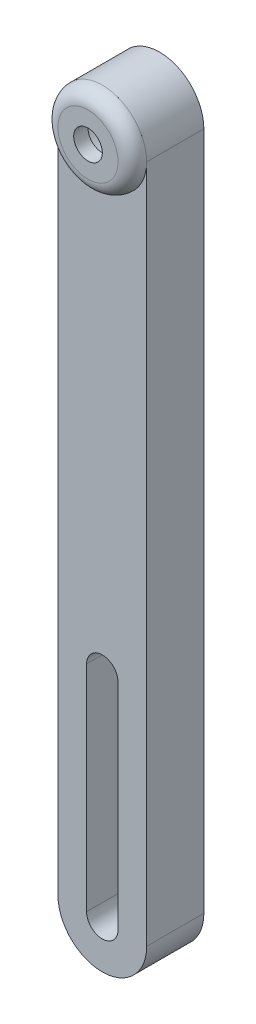
ISO-10303-21;
HEADER;
FILE_DESCRIPTION(('STEP AP214'),'2;1');
FILE_NAME('part.step','',(''),(''),'','','');
FILE_SCHEMA(('AUTOMOTIVE_DESIGN { 1 0 10303 214 1 1 1 1 }'));
ENDSEC;
DATA;
#1=APPLICATION_CONTEXT('core data for automotive mechanical design processes');
#2=APPLICATION_PROTOCOL_DEFINITION('international standard','automotive_design',2000,#1);
#3=PRODUCT_CONTEXT('',#1,'mechanical');
#4=PRODUCT('Part','Part','',(#3));
#5=PRODUCT_RELATED_PRODUCT_CATEGORY('part','',(#4));
#6=PRODUCT_DEFINITION_FORMATION('','',#4);
#7=PRODUCT_DEFINITION_CONTEXT('part definition',#1,'design');
#8=PRODUCT_DEFINITION('design','',#6,#7);
#9=PRODUCT_DEFINITION_SHAPE('','',#8);
#10=(LENGTH_UNIT() NAMED_UNIT(*) SI_UNIT(.MILLI.,.METRE.));
#11=(NAMED_UNIT(*) PLANE_ANGLE_UNIT() SI_UNIT($,.RADIAN.));
#12=(NAMED_UNIT(*) SI_UNIT($,.STERADIAN.) SOLID_ANGLE_UNIT());
#13=UNCERTAINTY_MEASURE_WITH_UNIT(LENGTH_MEASURE(1.E-05),#10,'distance_accuracy_value','');
#14=(GEOMETRIC_REPRESENTATION_CONTEXT(3) GLOBAL_UNCERTAINTY_ASSIGNED_CONTEXT((#13)) GLOBAL_UNIT_ASSIGNED_CONTEXT((#10,
#11,#12)) REPRESENTATION_CONTEXT('',''));
#15=CARTESIAN_POINT('',(0.,0.,0.));
#16=DIRECTION('',(0.,0.,1.));
#17=DIRECTION('',(1.,0.,0.));
#18=AXIS2_PLACEMENT_3D('',#15,#16,#17);
#19=CARTESIAN_POINT('',(-8.77761700194678,7.12304347826087,5.));
#20=DIRECTION('',(0.,0.,1.));
#21=DIRECTION('',(1.,0.,0.));
#22=AXIS2_PLACEMENT_3D('',#19,#20,#21);
#23=PLANE('',#22);
#24=CARTESIAN_POINT('',(-8.77761700194678,7.12304347826087,5.));
#25=DIRECTION('',(0.,0.,1.));
#26=DIRECTION('',(1.,0.,0.));
#27=AXIS2_PLACEMENT_3D('',#24,#25,#26);
#28=CIRCLE('',#27,2.1);
#29=CARTESIAN_POINT('',(-6.67761700194678,7.12304347826087,5.));
#30=VERTEX_POINT('',#29);
#31=EDGE_CURVE('E11',#30,#30,#28,.T.);
#32=ORIENTED_EDGE('',*,*,#31,.T.);
#33=EDGE_LOOP('',(#32));
#34=FACE_BOUND('',#33,.T.);
#35=CARTESIAN_POINT('',(-8.77761700194678,7.12304347826087,5.));
#36=DIRECTION('',(0.,0.,1.));
#37=DIRECTION('',(1.,0.,0.));
#38=AXIS2_PLACEMENT_3D('',#35,#36,#37);
#39=CIRCLE('',#38,1.);
#40=CARTESIAN_POINT('',(-7.77761700194678,7.12304347826087,5.));
#41=VERTEX_POINT('',#40);
#42=EDGE_CURVE('E54',#41,#41,#39,.T.);
#43=ORIENTED_EDGE('',*,*,#42,.F.);
#44=EDGE_LOOP('',(#43));
#45=FACE_BOUND('',#44,.T.);
#46=ADVANCED_FACE('F43',(#34,#45),#23,.T.);
#47=CARTESIAN_POINT('',(-8.77761700194678,7.12304347826087,4.));
#48=DIRECTION('',(0.,0.,1.));
#49=DIRECTION('',(1.,0.,0.));
#50=AXIS2_PLACEMENT_3D('',#47,#48,#49);
#51=PLANE('',#50);
#52=CARTESIAN_POINT('',(-8.77761700194678,7.12304347826087,4.));
#53=DIRECTION('',(0.,0.,1.));
#54=DIRECTION('',(1.,0.,0.));
#55=AXIS2_PLACEMENT_3D('',#52,#53,#54);
#56=CIRCLE('',#55,3.1);
#57=CARTESIAN_POINT('',(-5.67761700194678,7.12304347826087,4.));
#58=VERTEX_POINT('',#57);
#59=EDGE_CURVE('E50',#58,#58,#56,.T.);
#60=ORIENTED_EDGE('',*,*,#59,.F.);
#61=EDGE_LOOP('',(#60));
#62=FACE_BOUND('',#61,.T.);
#63=CARTESIAN_POINT('',(-8.77761700194678,7.12304347826087,4.));
#64=DIRECTION('',(0.,0.,1.));
#65=DIRECTION('',(1.,0.,0.));
#66=AXIS2_PLACEMENT_3D('',#63,#64,#65);
#67=CIRCLE('',#66,1.);
#68=CARTESIAN_POINT('',(-7.77761700194678,7.12304347826087,4.));
#69=VERTEX_POINT('',#68);
#70=EDGE_CURVE('E58',#69,#69,#67,.T.);
#71=ORIENTED_EDGE('',*,*,#70,.T.);
#72=EDGE_LOOP('',(#71));
#73=FACE_BOUND('',#72,.T.);
#74=ADVANCED_FACE('F64',(#62,#73),#51,.F.);
#75=CARTESIAN_POINT('',(-8.77761700194678,7.12304347826087,5.));
#76=DIRECTION('',(0.,0.,-1.));
#77=DIRECTION('',(-1.,0.,0.));
#78=AXIS2_PLACEMENT_3D('',#75,#76,#77);
#79=CYLINDRICAL_SURFACE('',#78,1.);
#80=ORIENTED_EDGE('',*,*,#42,.T.);
#81=EDGE_LOOP('',(#80));
#82=FACE_BOUND('',#81,.T.);
#83=ORIENTED_EDGE('',*,*,#70,.F.);
#84=EDGE_LOOP('',(#83));
#85=FACE_BOUND('',#84,.T.);
#86=ADVANCED_FACE('F66',(#82,#85),#79,.F.);
#87=CARTESIAN_POINT('',(-8.77761700194678,7.12304347826087,4.));
#88=DIRECTION('',(0.,0.,1.));
#89=DIRECTION('',(1.,0.,0.));
#90=AXIS2_PLACEMENT_3D('',#87,#88,#89);
#91=TOROIDAL_SURFACE('',#90,2.1,1.);
#92=ORIENTED_EDGE('',*,*,#59,.T.);
#93=EDGE_LOOP('',(#92));
#94=FACE_BOUND('',#93,.T.);
#95=ORIENTED_EDGE('',*,*,#31,.F.);
#96=EDGE_LOOP('',(#95));
#97=FACE_BOUND('',#96,.T.);
#98=ADVANCED_FACE('F45',(#94,#97),#91,.T.);
#99=CLOSED_SHELL('',(#46,#74,#86,#98));
#100=MANIFOLD_SOLID_BREP('B2',#99);
#101=CARTESIAN_POINT('',(-8.77761700194678,7.12304347826087,4.));
#102=DIRECTION('',(0.,0.,1.));
#103=DIRECTION('',(1.,0.,0.));
#104=AXIS2_PLACEMENT_3D('',#101,#102,#103);
#105=PLANE('',#104);
#106=CARTESIAN_POINT('',(-8.77761700194678,7.12304347826087,4.));
#107=DIRECTION('',(0.,0.,1.));
#108=DIRECTION('',(1.,0.,0.));
#109=AXIS2_PLACEMENT_3D('',#106,#107,#108);
#110=CIRCLE('',#109,3.1);
#111=CARTESIAN_POINT('',(-5.67761700194678,7.12304347826087,4.));
#112=VERTEX_POINT('',#111);
#113=CARTESIAN_POINT('',(-11.8776170019468,7.12304347826087,4.));
#114=VERTEX_POINT('',#113);
#115=EDGE_CURVE('E212',#112,#114,#110,.T.);
#116=ORIENTED_EDGE('',*,*,#115,.T.);
#117=DIRECTION('',(0.,-1.,0.));
#118=VECTOR('',#117,1.);
#119=CARTESIAN_POINT('',(-11.8776170019468,7.12304347826087,4.));
#120=LINE('',#119,#118);
#121=CARTESIAN_POINT('',(-11.8776170019468,-40.3769565217391,4.));
#122=VERTEX_POINT('',#121);
#123=EDGE_CURVE('E215',#114,#122,#120,.T.);
#124=ORIENTED_EDGE('',*,*,#123,.T.);
#125=CARTESIAN_POINT('',(-8.77761700194678,-40.3769565217391,4.));
#126=DIRECTION('',(0.,0.,1.));
#127=DIRECTION('',(1.,0.,0.));
#128=AXIS2_PLACEMENT_3D('',#125,#126,#127);
#129=CIRCLE('',#128,3.1);
#130=CARTESIAN_POINT('',(-5.67761700194677,-40.3769565217391,4.));
#131=VERTEX_POINT('',#130);
#132=EDGE_CURVE('E218',#122,#131,#129,.T.);
#133=ORIENTED_EDGE('',*,*,#132,.T.);
#134=DIRECTION('',(0.,1.,0.));
#135=VECTOR('',#134,1.);
#136=CARTESIAN_POINT('',(-5.67761700194678,7.12304347826087,4.));
#137=LINE('',#136,#135);
#138=EDGE_CURVE('E220',#131,#112,#137,.T.);
#139=ORIENTED_EDGE('',*,*,#138,.T.);
#140=EDGE_LOOP('',(#116,#124,#133,#139));
#141=FACE_BOUND('',#140,.T.);
#142=CARTESIAN_POINT('',(-8.77761700194678,7.12304347826087,4.));
#143=DIRECTION('',(0.,0.,1.));
#144=DIRECTION('',(1.,0.,0.));
#145=AXIS2_PLACEMENT_3D('',#142,#143,#144);
#146=CIRCLE('',#145,2.5);
#147=CARTESIAN_POINT('',(-6.27761700194678,7.12304347826087,4.));
#148=VERTEX_POINT('',#147);
#149=EDGE_CURVE('E206',#148,#148,#146,.T.);
#150=ORIENTED_EDGE('',*,*,#149,.F.);
#151=EDGE_LOOP('',(#150));
#152=FACE_BOUND('',#151,.T.);
#153=DIRECTION('',(0.,-1.,0.));
#154=VECTOR('',#153,1.);
#155=CARTESIAN_POINT('',(-9.87761700194677,-25.3769565217391,4.));
#156=LINE('',#155,#154);
#157=CARTESIAN_POINT('',(-9.87761700194677,-25.3769565217391,4.));
#158=VERTEX_POINT('',#157);
#159=CARTESIAN_POINT('',(-9.87761700194677,-40.3769565217391,4.));
#160=VERTEX_POINT('',#159);
#161=EDGE_CURVE('E178',#158,#160,#156,.T.);
#162=ORIENTED_EDGE('',*,*,#161,.F.);
#163=CARTESIAN_POINT('',(-8.77761700194678,-25.3769565217391,4.));
#164=DIRECTION('',(0.,0.,1.));
#165=DIRECTION('',(1.,0.,0.));
#166=AXIS2_PLACEMENT_3D('',#163,#164,#165);
#167=CIRCLE('',#166,1.09999999999999);
#168=CARTESIAN_POINT('',(-7.67761700194678,-25.3769565217391,4.));
#169=VERTEX_POINT('',#168);
#170=EDGE_CURVE('E170',#169,#158,#167,.T.);
#171=ORIENTED_EDGE('',*,*,#170,.F.);
#172=DIRECTION('',(0.,1.,0.));
#173=VECTOR('',#172,1.);
#174=CARTESIAN_POINT('',(-7.67761700194678,-25.3769565217391,4.));
#175=LINE('',#174,#173);
#176=CARTESIAN_POINT('',(-7.67761700194678,-40.3769565217391,4.));
#177=VERTEX_POINT('',#176);
#178=EDGE_CURVE('E192',#177,#169,#175,.T.);
#179=ORIENTED_EDGE('',*,*,#178,.F.);
#180=CARTESIAN_POINT('',(-8.77761700194678,-40.3769565217391,4.));
#181=DIRECTION('',(0.,0.,1.));
#182=DIRECTION('',(1.,0.,0.));
#183=AXIS2_PLACEMENT_3D('',#180,#181,#182);
#184=CIRCLE('',#183,1.09999999999999);
#185=EDGE_CURVE('E190',#160,#177,#184,.T.);
#186=ORIENTED_EDGE('',*,*,#185,.F.);
#187=EDGE_LOOP('',(#162,#171,#179,#186));
#188=FACE_BOUND('',#187,.T.);
#189=ADVANCED_FACE('F105',(#141,#152,#188),#105,.T.);
#190=CARTESIAN_POINT('',(-8.77761700194678,7.12304347826087,0.));
#191=DIRECTION('',(0.,0.,1.));
#192=DIRECTION('',(1.,0.,0.));
#193=AXIS2_PLACEMENT_3D('',#190,#191,#192);
#194=PLANE('',#193);
#195=CARTESIAN_POINT('',(-8.77761700194678,7.12304347826087,0.));
#196=DIRECTION('',(0.,0.,1.));
#197=DIRECTION('',(1.,0.,0.));
#198=AXIS2_PLACEMENT_3D('',#195,#196,#197);
#199=CIRCLE('',#198,2.5);
#200=CARTESIAN_POINT('',(-6.27761700194678,7.12304347826087,0.));
#201=VERTEX_POINT('',#200);
#202=EDGE_CURVE('E186',#201,#201,#199,.T.);
#203=ORIENTED_EDGE('',*,*,#202,.T.);
#204=EDGE_LOOP('',(#203));
#205=FACE_BOUND('',#204,.T.);
#206=CARTESIAN_POINT('',(-8.77761700194678,7.12304347826087,0.));
#207=DIRECTION('',(0.,0.,1.));
#208=DIRECTION('',(1.,0.,0.));
#209=AXIS2_PLACEMENT_3D('',#206,#207,#208);
#210=CIRCLE('',#209,3.1);
#211=CARTESIAN_POINT('',(-5.67761700194678,7.12304347826087,0.));
#212=VERTEX_POINT('',#211);
#213=CARTESIAN_POINT('',(-11.8776170019468,7.12304347826087,0.));
#214=VERTEX_POINT('',#213);
#215=EDGE_CURVE('E209',#212,#214,#210,.T.);
#216=ORIENTED_EDGE('',*,*,#215,.F.);
#217=DIRECTION('',(0.,1.,0.));
#218=VECTOR('',#217,1.);
#219=CARTESIAN_POINT('',(-5.67761700194678,7.12304347826087,0.));
#220=LINE('',#219,#218);
#221=CARTESIAN_POINT('',(-5.67761700194677,-40.3769565217391,0.));
#222=VERTEX_POINT('',#221);
#223=EDGE_CURVE('E216',#222,#212,#220,.T.);
#224=ORIENTED_EDGE('',*,*,#223,.F.);
#225=CARTESIAN_POINT('',(-8.77761700194678,-40.3769565217391,0.));
#226=DIRECTION('',(0.,0.,1.));
#227=DIRECTION('',(1.,0.,0.));
#228=AXIS2_PLACEMENT_3D('',#225,#226,#227);
#229=CIRCLE('',#228,3.1);
#230=CARTESIAN_POINT('',(-11.8776170019468,-40.3769565217391,0.));
#231=VERTEX_POINT('',#230);
#232=EDGE_CURVE('E227',#231,#222,#229,.T.);
#233=ORIENTED_EDGE('',*,*,#232,.F.);
#234=DIRECTION('',(0.,-1.,0.));
#235=VECTOR('',#234,1.);
#236=CARTESIAN_POINT('',(-11.8776170019468,7.12304347826087,0.));
#237=LINE('',#236,#235);
#238=EDGE_CURVE('E225',#214,#231,#237,.T.);
#239=ORIENTED_EDGE('',*,*,#238,.F.);
#240=EDGE_LOOP('',(#216,#224,#233,#239));
#241=FACE_BOUND('',#240,.T.);
#242=CARTESIAN_POINT('',(-8.77761700194678,-25.3769565217391,0.));
#243=DIRECTION('',(0.,0.,1.));
#244=DIRECTION('',(1.,0.,0.));
#245=AXIS2_PLACEMENT_3D('',#242,#243,#244);
#246=CIRCLE('',#245,1.09999999999999);
#247=CARTESIAN_POINT('',(-7.67761700194678,-25.3769565217391,0.));
#248=VERTEX_POINT('',#247);
#249=CARTESIAN_POINT('',(-9.87761700194677,-25.3769565217391,0.));
#250=VERTEX_POINT('',#249);
#251=EDGE_CURVE('E128',#248,#250,#246,.T.);
#252=ORIENTED_EDGE('',*,*,#251,.T.);
#253=DIRECTION('',(0.,-1.,0.));
#254=VECTOR('',#253,1.);
#255=CARTESIAN_POINT('',(-9.87761700194677,-25.3769565217391,0.));
#256=LINE('',#255,#254);
#257=CARTESIAN_POINT('',(-9.87761700194677,-40.3769565217391,0.));
#258=VERTEX_POINT('',#257);
#259=EDGE_CURVE('E185',#250,#258,#256,.T.);
#260=ORIENTED_EDGE('',*,*,#259,.T.);
#261=CARTESIAN_POINT('',(-8.77761700194678,-40.3769565217391,0.));
#262=DIRECTION('',(0.,0.,1.));
#263=DIRECTION('',(1.,0.,0.));
#264=AXIS2_PLACEMENT_3D('',#261,#262,#263);
#265=CIRCLE('',#264,1.09999999999999);
#266=CARTESIAN_POINT('',(-7.67761700194678,-40.3769565217391,0.));
#267=VERTEX_POINT('',#266);
#268=EDGE_CURVE('E198',#258,#267,#265,.T.);
#269=ORIENTED_EDGE('',*,*,#268,.T.);
#270=DIRECTION('',(0.,1.,0.));
#271=VECTOR('',#270,1.);
#272=CARTESIAN_POINT('',(-7.67761700194678,-25.3769565217391,0.));
#273=LINE('',#272,#271);
#274=EDGE_CURVE('E179',#267,#248,#273,.T.);
#275=ORIENTED_EDGE('',*,*,#274,.T.);
#276=EDGE_LOOP('',(#252,#260,#269,#275));
#277=FACE_BOUND('',#276,.T.);
#278=ADVANCED_FACE('F245',(#205,#241,#277),#194,.F.);
#279=CARTESIAN_POINT('',(-8.77761700194678,7.12304347826087,4.));
#280=DIRECTION('',(0.,0.,-1.));
#281=DIRECTION('',(-1.,0.,0.));
#282=AXIS2_PLACEMENT_3D('',#279,#280,#281);
#283=CYLINDRICAL_SURFACE('',#282,3.1);
#284=ORIENTED_EDGE('',*,*,#215,.T.);
#285=DIRECTION('',(0.,0.,-1.));
#286=VECTOR('',#285,1.);
#287=CARTESIAN_POINT('',(-11.8776170019468,7.12304347826087,4.));
#288=LINE('',#287,#286);
#289=EDGE_CURVE('E41',#114,#214,#288,.T.);
#290=ORIENTED_EDGE('',*,*,#289,.F.);
#291=ORIENTED_EDGE('',*,*,#115,.F.);
#292=DIRECTION('',(0.,0.,-1.));
#293=VECTOR('',#292,1.);
#294=CARTESIAN_POINT('',(-5.67761700194678,7.12304347826087,4.));
#295=LINE('',#294,#293);
#296=EDGE_CURVE('E222',#112,#212,#295,.T.);
#297=ORIENTED_EDGE('',*,*,#296,.T.);
#298=EDGE_LOOP('',(#284,#290,#291,#297));
#299=FACE_BOUND('',#298,.T.);
#300=ADVANCED_FACE('F107',(#299),#283,.T.);
#301=CARTESIAN_POINT('',(-11.8776170019468,7.12304347826087,4.));
#302=DIRECTION('',(1.,0.,0.));
#303=DIRECTION('',(0.,1.,0.));
#304=AXIS2_PLACEMENT_3D('',#301,#302,#303);
#305=PLANE('',#304);
#306=ORIENTED_EDGE('',*,*,#238,.T.);
#307=DIRECTION('',(0.,0.,-1.));
#308=VECTOR('',#307,1.);
#309=CARTESIAN_POINT('',(-11.8776170019468,-40.3769565217391,4.));
#310=LINE('',#309,#308);
#311=EDGE_CURVE('E113',#122,#231,#310,.T.);
#312=ORIENTED_EDGE('',*,*,#311,.F.);
#313=ORIENTED_EDGE('',*,*,#123,.F.);
#314=ORIENTED_EDGE('',*,*,#289,.T.);
#315=EDGE_LOOP('',(#306,#312,#313,#314));
#316=FACE_BOUND('',#315,.T.);
#317=ADVANCED_FACE('F256',(#316),#305,.F.);
#318=CARTESIAN_POINT('',(-8.77761700194678,-40.3769565217391,4.));
#319=DIRECTION('',(0.,0.,-1.));
#320=DIRECTION('',(-1.,0.,0.));
#321=AXIS2_PLACEMENT_3D('',#318,#319,#320);
#322=CYLINDRICAL_SURFACE('',#321,3.1);
#323=ORIENTED_EDGE('',*,*,#232,.T.);
#324=DIRECTION('',(0.,0.,-1.));
#325=VECTOR('',#324,1.);
#326=CARTESIAN_POINT('',(-5.67761700194677,-40.3769565217391,4.));
#327=LINE('',#326,#325);
#328=EDGE_CURVE('E232',#131,#222,#327,.T.);
#329=ORIENTED_EDGE('',*,*,#328,.F.);
#330=ORIENTED_EDGE('',*,*,#132,.F.);
#331=ORIENTED_EDGE('',*,*,#311,.T.);
#332=EDGE_LOOP('',(#323,#329,#330,#331));
#333=FACE_BOUND('',#332,.T.);
#334=ADVANCED_FACE('F239',(#333),#322,.T.);
#335=CARTESIAN_POINT('',(-5.67761700194678,7.12304347826087,4.));
#336=DIRECTION('',(-1.,0.,0.));
#337=DIRECTION('',(0.,-1.,0.));
#338=AXIS2_PLACEMENT_3D('',#335,#336,#337);
#339=PLANE('',#338);
#340=ORIENTED_EDGE('',*,*,#223,.T.);
#341=ORIENTED_EDGE('',*,*,#296,.F.);
#342=ORIENTED_EDGE('',*,*,#138,.F.);
#343=ORIENTED_EDGE('',*,*,#328,.T.);
#344=EDGE_LOOP('',(#340,#341,#342,#343));
#345=FACE_BOUND('',#344,.T.);
#346=ADVANCED_FACE('F249',(#345),#339,.F.);
#347=CARTESIAN_POINT('',(-8.77761700194678,7.12304347826087,4.));
#348=DIRECTION('',(0.,0.,-1.));
#349=DIRECTION('',(-1.,0.,0.));
#350=AXIS2_PLACEMENT_3D('',#347,#348,#349);
#351=CYLINDRICAL_SURFACE('',#350,2.5);
#352=ORIENTED_EDGE('',*,*,#149,.T.);
#353=EDGE_LOOP('',(#352));
#354=FACE_BOUND('',#353,.T.);
#355=ORIENTED_EDGE('',*,*,#202,.F.);
#356=EDGE_LOOP('',(#355));
#357=FACE_BOUND('',#356,.T.);
#358=ADVANCED_FACE('F271',(#354,#357),#351,.F.);
#359=CARTESIAN_POINT('',(-8.77761700194678,-25.3769565217391,4.));
#360=DIRECTION('',(0.,0.,-1.));
#361=DIRECTION('',(-1.,0.,0.));
#362=AXIS2_PLACEMENT_3D('',#359,#360,#361);
#363=CYLINDRICAL_SURFACE('',#362,1.09999999999999);
#364=ORIENTED_EDGE('',*,*,#251,.F.);
#365=DIRECTION('',(0.,0.,-1.));
#366=VECTOR('',#365,1.);
#367=CARTESIAN_POINT('',(-7.67761700194678,-25.3769565217391,4.));
#368=LINE('',#367,#366);
#369=EDGE_CURVE('E174',#169,#248,#368,.T.);
#370=ORIENTED_EDGE('',*,*,#369,.F.);
#371=ORIENTED_EDGE('',*,*,#170,.T.);
#372=DIRECTION('',(0.,0.,-1.));
#373=VECTOR('',#372,1.);
#374=CARTESIAN_POINT('',(-9.87761700194677,-25.3769565217391,4.));
#375=LINE('',#374,#373);
#376=EDGE_CURVE('E173',#158,#250,#375,.T.);
#377=ORIENTED_EDGE('',*,*,#376,.T.);
#378=EDGE_LOOP('',(#364,#370,#371,#377));
#379=FACE_BOUND('',#378,.T.);
#380=ADVANCED_FACE('F172',(#379),#363,.F.);
#381=CARTESIAN_POINT('',(-9.87761700194677,-25.3769565217391,4.));
#382=DIRECTION('',(1.,0.,0.));
#383=DIRECTION('',(0.,1.,0.));
#384=AXIS2_PLACEMENT_3D('',#381,#382,#383);
#385=PLANE('',#384);
#386=ORIENTED_EDGE('',*,*,#259,.F.);
#387=ORIENTED_EDGE('',*,*,#376,.F.);
#388=ORIENTED_EDGE('',*,*,#161,.T.);
#389=DIRECTION('',(0.,0.,-1.));
#390=VECTOR('',#389,1.);
#391=CARTESIAN_POINT('',(-9.87761700194677,-40.3769565217391,4.));
#392=LINE('',#391,#390);
#393=EDGE_CURVE('E187',#160,#258,#392,.T.);
#394=ORIENTED_EDGE('',*,*,#393,.T.);
#395=EDGE_LOOP('',(#386,#387,#388,#394));
#396=FACE_BOUND('',#395,.T.);
#397=ADVANCED_FACE('F182',(#396),#385,.T.);
#398=CARTESIAN_POINT('',(-8.77761700194678,-40.3769565217391,4.));
#399=DIRECTION('',(0.,0.,-1.));
#400=DIRECTION('',(-1.,0.,0.));
#401=AXIS2_PLACEMENT_3D('',#398,#399,#400);
#402=CYLINDRICAL_SURFACE('',#401,1.09999999999999);
#403=ORIENTED_EDGE('',*,*,#268,.F.);
#404=ORIENTED_EDGE('',*,*,#393,.F.);
#405=ORIENTED_EDGE('',*,*,#185,.T.);
#406=DIRECTION('',(0.,0.,-1.));
#407=VECTOR('',#406,1.);
#408=CARTESIAN_POINT('',(-7.67761700194678,-40.3769565217391,4.));
#409=LINE('',#408,#407);
#410=EDGE_CURVE('E120',#177,#267,#409,.T.);
#411=ORIENTED_EDGE('',*,*,#410,.T.);
#412=EDGE_LOOP('',(#403,#404,#405,#411));
#413=FACE_BOUND('',#412,.T.);
#414=ADVANCED_FACE('F288',(#413),#402,.F.);
#415=CARTESIAN_POINT('',(-7.67761700194678,-25.3769565217391,4.));
#416=DIRECTION('',(-1.,0.,0.));
#417=DIRECTION('',(0.,-1.,0.));
#418=AXIS2_PLACEMENT_3D('',#415,#416,#417);
#419=PLANE('',#418);
#420=ORIENTED_EDGE('',*,*,#274,.F.);
#421=ORIENTED_EDGE('',*,*,#410,.F.);
#422=ORIENTED_EDGE('',*,*,#178,.T.);
#423=ORIENTED_EDGE('',*,*,#369,.T.);
#424=EDGE_LOOP('',(#420,#421,#422,#423));
#425=FACE_BOUND('',#424,.T.);
#426=ADVANCED_FACE('F293',(#425),#419,.T.);
#427=CLOSED_SHELL('',(#189,#278,#300,#317,#334,#346,#358,#380,#397,#414,#426));
#428=MANIFOLD_SOLID_BREP('B6',#427);
#429=ADVANCED_BREP_SHAPE_REPRESENTATION('',(#18,#100,#428),#14);
#430=SHAPE_DEFINITION_REPRESENTATION(#9,#429);
ENDSEC;
END-ISO-10303-21;
